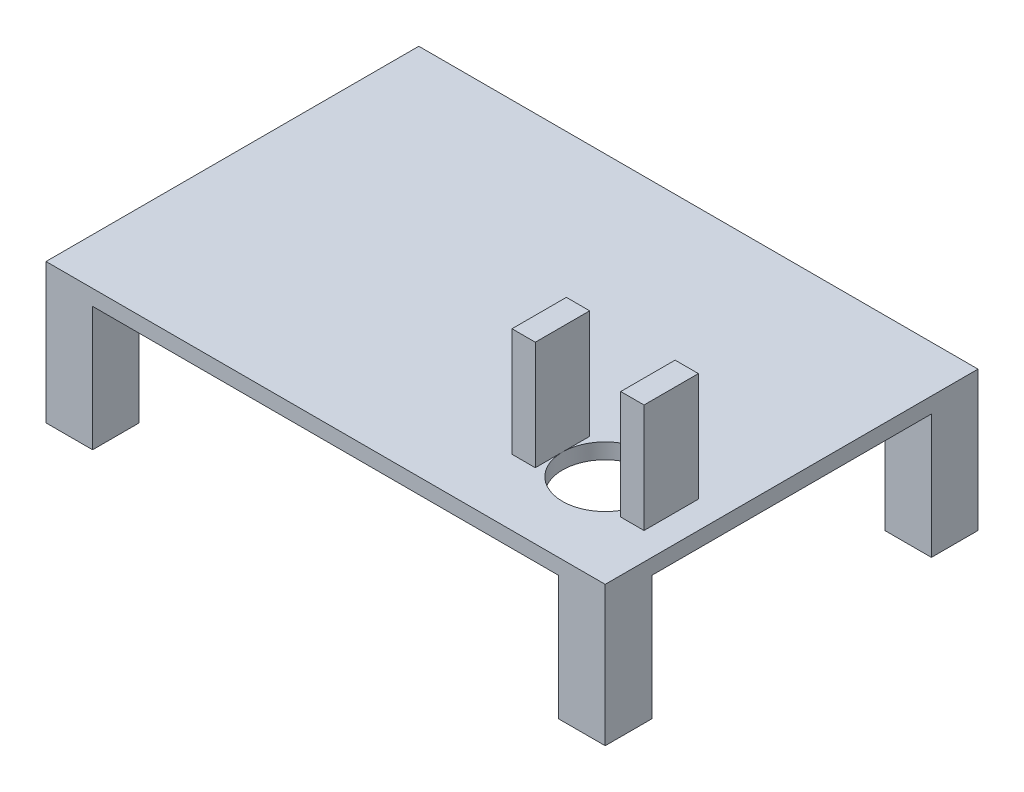
ISO-10303-21;
HEADER;
FILE_DESCRIPTION(('STEP AP214'),'2;1');
FILE_NAME('part.step','',(''),(''),'','','');
FILE_SCHEMA(('AUTOMOTIVE_DESIGN { 1 0 10303 214 1 1 1 1 }'));
ENDSEC;
DATA;
#1=APPLICATION_CONTEXT('core data for automotive mechanical design processes');
#2=APPLICATION_PROTOCOL_DEFINITION('international standard','automotive_design',2000,#1);
#3=PRODUCT_CONTEXT('',#1,'mechanical');
#4=PRODUCT('Part','Part','',(#3));
#5=PRODUCT_RELATED_PRODUCT_CATEGORY('part','',(#4));
#6=PRODUCT_DEFINITION_FORMATION('','',#4);
#7=PRODUCT_DEFINITION_CONTEXT('part definition',#1,'design');
#8=PRODUCT_DEFINITION('design','',#6,#7);
#9=PRODUCT_DEFINITION_SHAPE('','',#8);
#10=(LENGTH_UNIT() NAMED_UNIT(*) SI_UNIT(.MILLI.,.METRE.));
#11=(NAMED_UNIT(*) PLANE_ANGLE_UNIT() SI_UNIT($,.RADIAN.));
#12=(NAMED_UNIT(*) SI_UNIT($,.STERADIAN.) SOLID_ANGLE_UNIT());
#13=UNCERTAINTY_MEASURE_WITH_UNIT(LENGTH_MEASURE(1.E-05),#10,'distance_accuracy_value','');
#14=(GEOMETRIC_REPRESENTATION_CONTEXT(3) GLOBAL_UNCERTAINTY_ASSIGNED_CONTEXT((#13)) GLOBAL_UNIT_ASSIGNED_CONTEXT((#10,
#11,#12)) REPRESENTATION_CONTEXT('',''));
#15=CARTESIAN_POINT('',(0.,0.,0.));
#16=DIRECTION('',(0.,0.,1.));
#17=DIRECTION('',(1.,0.,0.));
#18=AXIS2_PLACEMENT_3D('',#15,#16,#17);
#19=CARTESIAN_POINT('',(0.,0.,0.));
#20=DIRECTION('',(0.,1.,0.));
#21=DIRECTION('',(0.,0.,1.));
#22=AXIS2_PLACEMENT_3D('',#19,#20,#21);
#23=PLANE('',#22);
#24=CARTESIAN_POINT('',(762.,0.,-152.4));
#25=DIRECTION('',(0.,1.,0.));
#26=DIRECTION('',(0.,0.,1.));
#27=AXIS2_PLACEMENT_3D('',#24,#25,#26);
#28=CIRCLE('',#27,69.85);
#29=CARTESIAN_POINT('',(762.,0.,-82.55));
#30=VERTEX_POINT('',#29);
#31=EDGE_CURVE('E428',#30,#30,#28,.T.);
#32=ORIENTED_EDGE('',*,*,#31,.T.);
#33=EDGE_LOOP('',(#32));
#34=FACE_BOUND('',#33,.T.);
#35=DIRECTION('',(0.,0.,-1.));
#36=VECTOR('',#35,1.);
#37=CARTESIAN_POINT('',(838.2,0.,0.));
#38=LINE('',#37,#36);
#39=CARTESIAN_POINT('',(838.2,0.,0.));
#40=VERTEX_POINT('',#39);
#41=CARTESIAN_POINT('',(838.2,0.,-76.2));
#42=VERTEX_POINT('',#41);
#43=EDGE_CURVE('E515',#40,#42,#38,.T.);
#44=ORIENTED_EDGE('',*,*,#43,.F.);
#45=DIRECTION('',(1.,0.,0.));
#46=VECTOR('',#45,1.);
#47=CARTESIAN_POINT('',(0.,0.,0.));
#48=LINE('',#47,#46);
#49=CARTESIAN_POINT('',(76.2,0.,0.));
#50=VERTEX_POINT('',#49);
#51=EDGE_CURVE('E232',#50,#40,#48,.T.);
#52=ORIENTED_EDGE('',*,*,#51,.F.);
#53=DIRECTION('',(0.,0.,1.));
#54=VECTOR('',#53,1.);
#55=CARTESIAN_POINT('',(76.2,0.,0.));
#56=LINE('',#55,#54);
#57=CARTESIAN_POINT('',(76.2,0.,-76.2));
#58=VERTEX_POINT('',#57);
#59=EDGE_CURVE('E310',#58,#50,#56,.T.);
#60=ORIENTED_EDGE('',*,*,#59,.F.);
#61=DIRECTION('',(1.,0.,0.));
#62=VECTOR('',#61,1.);
#63=CARTESIAN_POINT('',(0.,0.,-76.2));
#64=LINE('',#63,#62);
#65=CARTESIAN_POINT('',(0.,0.,-76.2));
#66=VERTEX_POINT('',#65);
#67=EDGE_CURVE('E304',#66,#58,#64,.T.);
#68=ORIENTED_EDGE('',*,*,#67,.F.);
#69=DIRECTION('',(0.,0.,-1.));
#70=VECTOR('',#69,1.);
#71=CARTESIAN_POINT('',(0.,0.,0.));
#72=LINE('',#71,#70);
#73=CARTESIAN_POINT('',(0.,0.,-533.4));
#74=VERTEX_POINT('',#73);
#75=EDGE_CURVE('E442',#66,#74,#72,.T.);
#76=ORIENTED_EDGE('',*,*,#75,.T.);
#77=DIRECTION('',(-1.,0.,0.));
#78=VECTOR('',#77,1.);
#79=CARTESIAN_POINT('',(0.,0.,-533.4));
#80=LINE('',#79,#78);
#81=CARTESIAN_POINT('',(76.2,0.,-533.4));
#82=VERTEX_POINT('',#81);
#83=EDGE_CURVE('E270',#82,#74,#80,.T.);
#84=ORIENTED_EDGE('',*,*,#83,.F.);
#85=DIRECTION('',(0.,0.,1.));
#86=VECTOR('',#85,1.);
#87=CARTESIAN_POINT('',(76.2,0.,-533.4));
#88=LINE('',#87,#86);
#89=CARTESIAN_POINT('',(76.2,0.,-609.6));
#90=VERTEX_POINT('',#89);
#91=EDGE_CURVE('E276',#90,#82,#88,.T.);
#92=ORIENTED_EDGE('',*,*,#91,.F.);
#93=DIRECTION('',(1.,0.,0.));
#94=VECTOR('',#93,1.);
#95=CARTESIAN_POINT('',(0.,0.,-609.6));
#96=LINE('',#95,#94);
#97=CARTESIAN_POINT('',(838.2,0.,-609.6));
#98=VERTEX_POINT('',#97);
#99=EDGE_CURVE('E459',#90,#98,#96,.T.);
#100=ORIENTED_EDGE('',*,*,#99,.T.);
#101=DIRECTION('',(0.,0.,-1.));
#102=VECTOR('',#101,1.);
#103=CARTESIAN_POINT('',(838.2,0.,-533.4));
#104=LINE('',#103,#102);
#105=CARTESIAN_POINT('',(838.2,0.,-533.4));
#106=VERTEX_POINT('',#105);
#107=EDGE_CURVE('E63',#106,#98,#104,.T.);
#108=ORIENTED_EDGE('',*,*,#107,.F.);
#109=DIRECTION('',(-1.,0.,0.));
#110=VECTOR('',#109,1.);
#111=CARTESIAN_POINT('',(838.2,0.,-533.4));
#112=LINE('',#111,#110);
#113=CARTESIAN_POINT('',(914.4,0.,-533.4));
#114=VERTEX_POINT('',#113);
#115=EDGE_CURVE('E234',#114,#106,#112,.T.);
#116=ORIENTED_EDGE('',*,*,#115,.F.);
#117=DIRECTION('',(0.,0.,-1.));
#118=VECTOR('',#117,1.);
#119=CARTESIAN_POINT('',(914.4,0.,0.));
#120=LINE('',#119,#118);
#121=CARTESIAN_POINT('',(914.4,0.,-76.2));
#122=VERTEX_POINT('',#121);
#123=EDGE_CURVE('E456',#122,#114,#120,.T.);
#124=ORIENTED_EDGE('',*,*,#123,.F.);
#125=DIRECTION('',(1.,0.,0.));
#126=VECTOR('',#125,1.);
#127=CARTESIAN_POINT('',(838.2,0.,-76.2));
#128=LINE('',#127,#126);
#129=EDGE_CURVE('E228',#42,#122,#128,.T.);
#130=ORIENTED_EDGE('',*,*,#129,.F.);
#131=EDGE_LOOP('',(#44,#52,#60,#68,#76,#84,#92,#100,#108,#116,#124,#130));
#132=FACE_BOUND('',#131,.T.);
#133=ADVANCED_FACE('F39',(#34,#132),#23,.F.);
#134=CARTESIAN_POINT('',(0.,25.4,0.));
#135=DIRECTION('',(0.,1.,0.));
#136=DIRECTION('',(0.,0.,1.));
#137=AXIS2_PLACEMENT_3D('',#134,#135,#136);
#138=PLANE('',#137);
#139=DIRECTION('',(1.,0.,0.));
#140=VECTOR('',#139,1.);
#141=CARTESIAN_POINT('',(0.,25.4,0.));
#142=LINE('',#141,#140);
#143=CARTESIAN_POINT('',(0.,25.4,0.));
#144=VERTEX_POINT('',#143);
#145=CARTESIAN_POINT('',(914.4,25.4,0.));
#146=VERTEX_POINT('',#145);
#147=EDGE_CURVE('E437',#144,#146,#142,.T.);
#148=ORIENTED_EDGE('',*,*,#147,.T.);
#149=DIRECTION('',(0.,0.,-1.));
#150=VECTOR('',#149,1.);
#151=CARTESIAN_POINT('',(914.4,25.4,0.));
#152=LINE('',#151,#150);
#153=CARTESIAN_POINT('',(914.4,25.4,-609.6));
#154=VERTEX_POINT('',#153);
#155=EDGE_CURVE('E441',#146,#154,#152,.T.);
#156=ORIENTED_EDGE('',*,*,#155,.T.);
#157=DIRECTION('',(1.,0.,0.));
#158=VECTOR('',#157,1.);
#159=CARTESIAN_POINT('',(0.,25.4,-609.6));
#160=LINE('',#159,#158);
#161=CARTESIAN_POINT('',(0.,25.4,-609.6));
#162=VERTEX_POINT('',#161);
#163=EDGE_CURVE('E445',#162,#154,#160,.T.);
#164=ORIENTED_EDGE('',*,*,#163,.F.);
#165=DIRECTION('',(0.,0.,-1.));
#166=VECTOR('',#165,1.);
#167=CARTESIAN_POINT('',(0.,25.4,0.));
#168=LINE('',#167,#166);
#169=EDGE_CURVE('E449',#144,#162,#168,.T.);
#170=ORIENTED_EDGE('',*,*,#169,.F.);
#171=EDGE_LOOP('',(#148,#156,#164,#170));
#172=FACE_BOUND('',#171,.T.);
#173=DIRECTION('',(0.,0.,-1.));
#174=VECTOR('',#173,1.);
#175=CARTESIAN_POINT('',(831.85,25.4,0.));
#176=LINE('',#175,#174);
#177=CARTESIAN_POINT('',(831.85,25.4,-152.4));
#178=VERTEX_POINT('',#177);
#179=CARTESIAN_POINT('',(831.85,25.4,-196.85));
#180=VERTEX_POINT('',#179);
#181=EDGE_CURVE('E367',#178,#180,#176,.T.);
#182=ORIENTED_EDGE('',*,*,#181,.T.);
#183=DIRECTION('',(1.,0.,0.));
#184=VECTOR('',#183,1.);
#185=CARTESIAN_POINT('',(1.43403807347416E-13,25.4,-196.850000000001));
#186=LINE('',#185,#184);
#187=CARTESIAN_POINT('',(869.95,25.4,-196.85));
#188=VERTEX_POINT('',#187);
#189=EDGE_CURVE('E375',#180,#188,#186,.T.);
#190=ORIENTED_EDGE('',*,*,#189,.T.);
#191=DIRECTION('',(0.,0.,-1.));
#192=VECTOR('',#191,1.);
#193=CARTESIAN_POINT('',(869.95,25.4,0.));
#194=LINE('',#193,#192);
#195=CARTESIAN_POINT('',(869.95,25.4,-107.95));
#196=VERTEX_POINT('',#195);
#197=EDGE_CURVE('E378',#196,#188,#194,.T.);
#198=ORIENTED_EDGE('',*,*,#197,.F.);
#199=DIRECTION('',(1.,0.,0.));
#200=VECTOR('',#199,1.);
#201=CARTESIAN_POINT('',(0.,25.4,-107.949999999999));
#202=LINE('',#201,#200);
#203=CARTESIAN_POINT('',(831.85,25.4,-107.95));
#204=VERTEX_POINT('',#203);
#205=EDGE_CURVE('E371',#204,#196,#202,.T.);
#206=ORIENTED_EDGE('',*,*,#205,.F.);
#207=EDGE_CURVE('E370',#204,#178,#176,.T.);
#208=ORIENTED_EDGE('',*,*,#207,.T.);
#209=CARTESIAN_POINT('',(762.,25.4,-152.4));
#210=DIRECTION('',(0.,1.,0.));
#211=DIRECTION('',(0.,0.,1.));
#212=AXIS2_PLACEMENT_3D('',#209,#210,#211);
#213=CIRCLE('',#212,69.85);
#214=CARTESIAN_POINT('',(692.15,25.4,-152.4));
#215=VERTEX_POINT('',#214);
#216=EDGE_CURVE('E429',#215,#178,#213,.T.);
#217=ORIENTED_EDGE('',*,*,#216,.F.);
#218=DIRECTION('',(0.,0.,-1.));
#219=VECTOR('',#218,1.);
#220=CARTESIAN_POINT('',(692.15,25.4,0.));
#221=LINE('',#220,#219);
#222=CARTESIAN_POINT('',(692.15,25.4,-107.95));
#223=VERTEX_POINT('',#222);
#224=EDGE_CURVE('E417',#223,#215,#221,.T.);
#225=ORIENTED_EDGE('',*,*,#224,.F.);
#226=DIRECTION('',(-1.,0.,0.));
#227=VECTOR('',#226,1.);
#228=CARTESIAN_POINT('',(1.57281595155232E-13,25.4,-107.950000000001));
#229=LINE('',#228,#227);
#230=CARTESIAN_POINT('',(654.05,25.4,-107.95));
#231=VERTEX_POINT('',#230);
#232=EDGE_CURVE('E422',#223,#231,#229,.T.);
#233=ORIENTED_EDGE('',*,*,#232,.T.);
#234=DIRECTION('',(0.,0.,-1.));
#235=VECTOR('',#234,1.);
#236=CARTESIAN_POINT('',(654.05,25.4,0.));
#237=LINE('',#236,#235);
#238=CARTESIAN_POINT('',(654.05,25.4,-196.85));
#239=VERTEX_POINT('',#238);
#240=EDGE_CURVE('E425',#231,#239,#237,.T.);
#241=ORIENTED_EDGE('',*,*,#240,.T.);
#242=DIRECTION('',(-1.,0.,0.));
#243=VECTOR('',#242,1.);
#244=CARTESIAN_POINT('',(-4.30211422042245E-13,25.4,-196.849999999999));
#245=LINE('',#244,#243);
#246=CARTESIAN_POINT('',(692.15,25.4,-196.85));
#247=VERTEX_POINT('',#246);
#248=EDGE_CURVE('E418',#247,#239,#245,.T.);
#249=ORIENTED_EDGE('',*,*,#248,.F.);
#250=EDGE_CURVE('E413',#215,#247,#221,.T.);
#251=ORIENTED_EDGE('',*,*,#250,.F.);
#252=EDGE_CURVE('E433',#178,#215,#213,.T.);
#253=ORIENTED_EDGE('',*,*,#252,.F.);
#254=EDGE_LOOP('',(#182,#190,#198,#206,#208,#217,#225,#233,#241,#249,#251,#253));
#255=FACE_BOUND('',#254,.T.);
#256=ADVANCED_FACE('F501',(#172,#255),#138,.T.);
#257=CARTESIAN_POINT('',(0.,25.4,0.));
#258=DIRECTION('',(0.,0.,-1.));
#259=DIRECTION('',(-1.,0.,0.));
#260=AXIS2_PLACEMENT_3D('',#257,#258,#259);
#261=PLANE('',#260);
#262=DIRECTION('',(0.,-1.,0.));
#263=VECTOR('',#262,1.);
#264=CARTESIAN_POINT('',(0.,25.4,0.));
#265=LINE('',#264,#263);
#266=CARTESIAN_POINT('',(0.,-203.2,0.));
#267=VERTEX_POINT('',#266);
#268=EDGE_CURVE('E453',#144,#267,#265,.T.);
#269=ORIENTED_EDGE('',*,*,#268,.T.);
#270=DIRECTION('',(-1.,0.,0.));
#271=VECTOR('',#270,1.);
#272=CARTESIAN_POINT('',(0.,-203.2,0.));
#273=LINE('',#272,#271);
#274=CARTESIAN_POINT('',(76.2,-203.2,0.));
#275=VERTEX_POINT('',#274);
#276=EDGE_CURVE('E316',#275,#267,#273,.T.);
#277=ORIENTED_EDGE('',*,*,#276,.F.);
#278=DIRECTION('',(0.,1.,0.));
#279=VECTOR('',#278,1.);
#280=CARTESIAN_POINT('',(76.2,-203.2,0.));
#281=LINE('',#280,#279);
#282=EDGE_CURVE('E320',#275,#50,#281,.T.);
#283=ORIENTED_EDGE('',*,*,#282,.T.);
#284=ORIENTED_EDGE('',*,*,#51,.T.);
#285=DIRECTION('',(0.,1.,0.));
#286=VECTOR('',#285,1.);
#287=CARTESIAN_POINT('',(838.2,-203.2,0.));
#288=LINE('',#287,#286);
#289=CARTESIAN_POINT('',(838.2,-203.2,0.));
#290=VERTEX_POINT('',#289);
#291=EDGE_CURVE('E211',#290,#40,#288,.T.);
#292=ORIENTED_EDGE('',*,*,#291,.F.);
#293=DIRECTION('',(-1.,0.,0.));
#294=VECTOR('',#293,1.);
#295=CARTESIAN_POINT('',(838.2,-203.2,0.));
#296=LINE('',#295,#294);
#297=CARTESIAN_POINT('',(914.4,-203.2,0.));
#298=VERTEX_POINT('',#297);
#299=EDGE_CURVE('E219',#298,#290,#296,.T.);
#300=ORIENTED_EDGE('',*,*,#299,.F.);
#301=DIRECTION('',(0.,-1.,0.));
#302=VECTOR('',#301,1.);
#303=CARTESIAN_POINT('',(914.4,25.4,0.));
#304=LINE('',#303,#302);
#305=EDGE_CURVE('E11',#146,#298,#304,.T.);
#306=ORIENTED_EDGE('',*,*,#305,.F.);
#307=ORIENTED_EDGE('',*,*,#147,.F.);
#308=EDGE_LOOP('',(#269,#277,#283,#284,#292,#300,#306,#307));
#309=FACE_BOUND('',#308,.T.);
#310=ADVANCED_FACE('F41',(#309),#261,.F.);
#311=CARTESIAN_POINT('',(914.4,25.4,0.));
#312=DIRECTION('',(-1.,0.,0.));
#313=DIRECTION('',(0.,0.,1.));
#314=AXIS2_PLACEMENT_3D('',#311,#312,#313);
#315=PLANE('',#314);
#316=ORIENTED_EDGE('',*,*,#305,.T.);
#317=DIRECTION('',(0.,0.,1.));
#318=VECTOR('',#317,1.);
#319=CARTESIAN_POINT('',(914.4,-203.2,0.));
#320=LINE('',#319,#318);
#321=CARTESIAN_POINT('',(914.4,-203.2,-76.2));
#322=VERTEX_POINT('',#321);
#323=EDGE_CURVE('E224',#322,#298,#320,.T.);
#324=ORIENTED_EDGE('',*,*,#323,.F.);
#325=DIRECTION('',(0.,1.,0.));
#326=VECTOR('',#325,1.);
#327=CARTESIAN_POINT('',(914.4,-203.2,-76.2));
#328=LINE('',#327,#326);
#329=EDGE_CURVE('E55',#322,#122,#328,.T.);
#330=ORIENTED_EDGE('',*,*,#329,.T.);
#331=ORIENTED_EDGE('',*,*,#123,.T.);
#332=DIRECTION('',(0.,1.,0.));
#333=VECTOR('',#332,1.);
#334=CARTESIAN_POINT('',(914.4,-203.2,-533.4));
#335=LINE('',#334,#333);
#336=CARTESIAN_POINT('',(914.4,-203.2,-533.4));
#337=VERTEX_POINT('',#336);
#338=EDGE_CURVE('E256',#337,#114,#335,.T.);
#339=ORIENTED_EDGE('',*,*,#338,.F.);
#340=DIRECTION('',(0.,0.,1.));
#341=VECTOR('',#340,1.);
#342=CARTESIAN_POINT('',(914.4,-203.2,-533.4));
#343=LINE('',#342,#341);
#344=CARTESIAN_POINT('',(914.4,-203.2,-609.6));
#345=VERTEX_POINT('',#344);
#346=EDGE_CURVE('E254',#345,#337,#343,.T.);
#347=ORIENTED_EDGE('',*,*,#346,.F.);
#348=DIRECTION('',(0.,-1.,0.));
#349=VECTOR('',#348,1.);
#350=CARTESIAN_POINT('',(914.4,25.4,-609.6));
#351=LINE('',#350,#349);
#352=EDGE_CURVE('E48',#154,#345,#351,.T.);
#353=ORIENTED_EDGE('',*,*,#352,.F.);
#354=ORIENTED_EDGE('',*,*,#155,.F.);
#355=EDGE_LOOP('',(#316,#324,#330,#331,#339,#347,#353,#354));
#356=FACE_BOUND('',#355,.T.);
#357=ADVANCED_FACE('F480',(#356),#315,.F.);
#358=CARTESIAN_POINT('',(0.,25.4,-609.6));
#359=DIRECTION('',(0.,0.,-1.));
#360=DIRECTION('',(-1.,0.,0.));
#361=AXIS2_PLACEMENT_3D('',#358,#359,#360);
#362=PLANE('',#361);
#363=ORIENTED_EDGE('',*,*,#99,.F.);
#364=DIRECTION('',(0.,1.,0.));
#365=VECTOR('',#364,1.);
#366=CARTESIAN_POINT('',(76.2,-203.2,-609.6));
#367=LINE('',#366,#365);
#368=CARTESIAN_POINT('',(76.2,-203.2,-609.6));
#369=VERTEX_POINT('',#368);
#370=EDGE_CURVE('E296',#369,#90,#367,.T.);
#371=ORIENTED_EDGE('',*,*,#370,.F.);
#372=DIRECTION('',(1.,0.,0.));
#373=VECTOR('',#372,1.);
#374=CARTESIAN_POINT('',(0.,-203.2,-609.6));
#375=LINE('',#374,#373);
#376=CARTESIAN_POINT('',(0.,-203.2,-609.6));
#377=VERTEX_POINT('',#376);
#378=EDGE_CURVE('E280',#377,#369,#375,.T.);
#379=ORIENTED_EDGE('',*,*,#378,.F.);
#380=DIRECTION('',(0.,-1.,0.));
#381=VECTOR('',#380,1.);
#382=CARTESIAN_POINT('',(0.,25.4,-609.6));
#383=LINE('',#382,#381);
#384=EDGE_CURVE('E466',#162,#377,#383,.T.);
#385=ORIENTED_EDGE('',*,*,#384,.F.);
#386=ORIENTED_EDGE('',*,*,#163,.T.);
#387=ORIENTED_EDGE('',*,*,#352,.T.);
#388=DIRECTION('',(1.,0.,0.));
#389=VECTOR('',#388,1.);
#390=CARTESIAN_POINT('',(838.2,-203.2,-609.6));
#391=LINE('',#390,#389);
#392=CARTESIAN_POINT('',(838.2,-203.2,-609.6));
#393=VERTEX_POINT('',#392);
#394=EDGE_CURVE('E250',#393,#345,#391,.T.);
#395=ORIENTED_EDGE('',*,*,#394,.F.);
#396=DIRECTION('',(0.,1.,0.));
#397=VECTOR('',#396,1.);
#398=CARTESIAN_POINT('',(838.2,-203.2,-609.6));
#399=LINE('',#398,#397);
#400=EDGE_CURVE('E263',#393,#98,#399,.T.);
#401=ORIENTED_EDGE('',*,*,#400,.T.);
#402=EDGE_LOOP('',(#363,#371,#379,#385,#386,#387,#395,#401));
#403=FACE_BOUND('',#402,.T.);
#404=ADVANCED_FACE('F473',(#403),#362,.T.);
#405=CARTESIAN_POINT('',(0.,25.4,0.));
#406=DIRECTION('',(-1.,0.,0.));
#407=DIRECTION('',(0.,0.,1.));
#408=AXIS2_PLACEMENT_3D('',#405,#406,#407);
#409=PLANE('',#408);
#410=ORIENTED_EDGE('',*,*,#75,.F.);
#411=DIRECTION('',(0.,1.,0.));
#412=VECTOR('',#411,1.);
#413=CARTESIAN_POINT('',(0.,-203.2,-76.2));
#414=LINE('',#413,#412);
#415=CARTESIAN_POINT('',(0.,-203.2,-76.2));
#416=VERTEX_POINT('',#415);
#417=EDGE_CURVE('E333',#416,#66,#414,.T.);
#418=ORIENTED_EDGE('',*,*,#417,.F.);
#419=DIRECTION('',(0.,0.,-1.));
#420=VECTOR('',#419,1.);
#421=CARTESIAN_POINT('',(0.,-203.2,0.));
#422=LINE('',#421,#420);
#423=EDGE_CURVE('E305',#267,#416,#422,.T.);
#424=ORIENTED_EDGE('',*,*,#423,.F.);
#425=ORIENTED_EDGE('',*,*,#268,.F.);
#426=ORIENTED_EDGE('',*,*,#169,.T.);
#427=ORIENTED_EDGE('',*,*,#384,.T.);
#428=DIRECTION('',(0.,0.,-1.));
#429=VECTOR('',#428,1.);
#430=CARTESIAN_POINT('',(0.,-203.2,-533.4));
#431=LINE('',#430,#429);
#432=CARTESIAN_POINT('',(0.,-203.2,-533.4));
#433=VERTEX_POINT('',#432);
#434=EDGE_CURVE('E275',#433,#377,#431,.T.);
#435=ORIENTED_EDGE('',*,*,#434,.F.);
#436=DIRECTION('',(0.,1.,0.));
#437=VECTOR('',#436,1.);
#438=CARTESIAN_POINT('',(0.,-203.2,-533.4));
#439=LINE('',#438,#437);
#440=EDGE_CURVE('E300',#433,#74,#439,.T.);
#441=ORIENTED_EDGE('',*,*,#440,.T.);
#442=EDGE_LOOP('',(#410,#418,#424,#425,#426,#427,#435,#441));
#443=FACE_BOUND('',#442,.T.);
#444=ADVANCED_FACE('F504',(#443),#409,.T.);
#445=CARTESIAN_POINT('',(762.,25.4,-152.4));
#446=DIRECTION('',(0.,-1.,0.));
#447=DIRECTION('',(0.,0.,-1.));
#448=AXIS2_PLACEMENT_3D('',#445,#446,#447);
#449=CYLINDRICAL_SURFACE('',#448,69.85);
#450=ORIENTED_EDGE('',*,*,#31,.F.);
#451=EDGE_LOOP('',(#450));
#452=FACE_BOUND('',#451,.T.);
#453=ORIENTED_EDGE('',*,*,#216,.T.);
#454=ORIENTED_EDGE('',*,*,#252,.T.);
#455=EDGE_LOOP('',(#453,#454));
#456=FACE_BOUND('',#455,.T.);
#457=ADVANCED_FACE('F533',(#452,#456),#449,.F.);
#458=CARTESIAN_POINT('',(654.05,203.2,-196.85));
#459=DIRECTION('',(1.,0.,0.));
#460=DIRECTION('',(0.,0.,-1.));
#461=AXIS2_PLACEMENT_3D('',#458,#459,#460);
#462=PLANE('',#461);
#463=ORIENTED_EDGE('',*,*,#240,.F.);
#464=DIRECTION('',(0.,-1.,0.));
#465=VECTOR('',#464,1.);
#466=CARTESIAN_POINT('',(654.05,203.2,-107.95));
#467=LINE('',#466,#465);
#468=CARTESIAN_POINT('',(654.05,203.2,-107.95));
#469=VERTEX_POINT('',#468);
#470=EDGE_CURVE('E409',#469,#231,#467,.T.);
#471=ORIENTED_EDGE('',*,*,#470,.F.);
#472=DIRECTION('',(0.,0.,1.));
#473=VECTOR('',#472,1.);
#474=CARTESIAN_POINT('',(654.05,203.2,-196.85));
#475=LINE('',#474,#473);
#476=CARTESIAN_POINT('',(654.05,203.2,-196.85));
#477=VERTEX_POINT('',#476);
#478=EDGE_CURVE('E382',#477,#469,#475,.T.);
#479=ORIENTED_EDGE('',*,*,#478,.F.);
#480=DIRECTION('',(0.,-1.,0.));
#481=VECTOR('',#480,1.);
#482=CARTESIAN_POINT('',(654.05,203.2,-196.85));
#483=LINE('',#482,#481);
#484=EDGE_CURVE('E397',#477,#239,#483,.T.);
#485=ORIENTED_EDGE('',*,*,#484,.T.);
#486=EDGE_LOOP('',(#463,#471,#479,#485));
#487=FACE_BOUND('',#486,.T.);
#488=ADVANCED_FACE('F555',(#487),#462,.F.);
#489=CARTESIAN_POINT('',(654.05,203.2,-107.95));
#490=DIRECTION('',(0.,0.,-1.));
#491=DIRECTION('',(-1.,0.,0.));
#492=AXIS2_PLACEMENT_3D('',#489,#490,#491);
#493=PLANE('',#492);
#494=ORIENTED_EDGE('',*,*,#232,.F.);
#495=DIRECTION('',(0.,-1.,0.));
#496=VECTOR('',#495,1.);
#497=CARTESIAN_POINT('',(692.15,203.2,-107.95));
#498=LINE('',#497,#496);
#499=CARTESIAN_POINT('',(692.15,203.2,-107.95));
#500=VERTEX_POINT('',#499);
#501=EDGE_CURVE('E405',#500,#223,#498,.T.);
#502=ORIENTED_EDGE('',*,*,#501,.F.);
#503=DIRECTION('',(1.,0.,0.));
#504=VECTOR('',#503,1.);
#505=CARTESIAN_POINT('',(654.05,203.2,-107.95));
#506=LINE('',#505,#504);
#507=EDGE_CURVE('E386',#469,#500,#506,.T.);
#508=ORIENTED_EDGE('',*,*,#507,.F.);
#509=ORIENTED_EDGE('',*,*,#470,.T.);
#510=EDGE_LOOP('',(#494,#502,#508,#509));
#511=FACE_BOUND('',#510,.T.);
#512=ADVANCED_FACE('F564',(#511),#493,.F.);
#513=CARTESIAN_POINT('',(692.15,203.2,-196.85));
#514=DIRECTION('',(1.,0.,0.));
#515=DIRECTION('',(0.,0.,-1.));
#516=AXIS2_PLACEMENT_3D('',#513,#514,#515);
#517=PLANE('',#516);
#518=ORIENTED_EDGE('',*,*,#501,.T.);
#519=ORIENTED_EDGE('',*,*,#224,.T.);
#520=ORIENTED_EDGE('',*,*,#250,.T.);
#521=DIRECTION('',(0.,-1.,0.));
#522=VECTOR('',#521,1.);
#523=CARTESIAN_POINT('',(692.15,203.2,-196.85));
#524=LINE('',#523,#522);
#525=CARTESIAN_POINT('',(692.15,203.2,-196.85));
#526=VERTEX_POINT('',#525);
#527=EDGE_CURVE('E401',#526,#247,#524,.T.);
#528=ORIENTED_EDGE('',*,*,#527,.F.);
#529=DIRECTION('',(0.,0.,1.));
#530=VECTOR('',#529,1.);
#531=CARTESIAN_POINT('',(692.15,203.2,-196.85));
#532=LINE('',#531,#530);
#533=EDGE_CURVE('E389',#526,#500,#532,.T.);
#534=ORIENTED_EDGE('',*,*,#533,.T.);
#535=EDGE_LOOP('',(#518,#519,#520,#528,#534));
#536=FACE_BOUND('',#535,.T.);
#537=ADVANCED_FACE('F574',(#536),#517,.T.);
#538=CARTESIAN_POINT('',(654.05,203.2,-196.85));
#539=DIRECTION('',(0.,0.,-1.));
#540=DIRECTION('',(-1.,0.,0.));
#541=AXIS2_PLACEMENT_3D('',#538,#539,#540);
#542=PLANE('',#541);
#543=ORIENTED_EDGE('',*,*,#527,.T.);
#544=ORIENTED_EDGE('',*,*,#248,.T.);
#545=ORIENTED_EDGE('',*,*,#484,.F.);
#546=DIRECTION('',(1.,0.,0.));
#547=VECTOR('',#546,1.);
#548=CARTESIAN_POINT('',(654.05,203.2,-196.85));
#549=LINE('',#548,#547);
#550=EDGE_CURVE('E393',#477,#526,#549,.T.);
#551=ORIENTED_EDGE('',*,*,#550,.T.);
#552=EDGE_LOOP('',(#543,#544,#545,#551));
#553=FACE_BOUND('',#552,.T.);
#554=ADVANCED_FACE('F584',(#553),#542,.T.);
#555=CARTESIAN_POINT('',(0.,203.2,0.));
#556=DIRECTION('',(0.,1.,0.));
#557=DIRECTION('',(0.,0.,1.));
#558=AXIS2_PLACEMENT_3D('',#555,#556,#557);
#559=PLANE('',#558);
#560=ORIENTED_EDGE('',*,*,#478,.T.);
#561=ORIENTED_EDGE('',*,*,#507,.T.);
#562=ORIENTED_EDGE('',*,*,#533,.F.);
#563=ORIENTED_EDGE('',*,*,#550,.F.);
#564=EDGE_LOOP('',(#560,#561,#562,#563));
#565=FACE_BOUND('',#564,.T.);
#566=ADVANCED_FACE('F594',(#565),#559,.T.);
#567=CARTESIAN_POINT('',(869.95,203.2,-196.85));
#568=DIRECTION('',(1.,0.,0.));
#569=DIRECTION('',(0.,0.,-1.));
#570=AXIS2_PLACEMENT_3D('',#567,#568,#569);
#571=PLANE('',#570);
#572=DIRECTION('',(0.,-1.,0.));
#573=VECTOR('',#572,1.);
#574=CARTESIAN_POINT('',(869.95,203.2,-107.95));
#575=LINE('',#574,#573);
#576=CARTESIAN_POINT('',(869.95,203.2,-107.95));
#577=VERTEX_POINT('',#576);
#578=EDGE_CURVE('E338',#577,#196,#575,.T.);
#579=ORIENTED_EDGE('',*,*,#578,.T.);
#580=ORIENTED_EDGE('',*,*,#197,.T.);
#581=DIRECTION('',(0.,-1.,0.));
#582=VECTOR('',#581,1.);
#583=CARTESIAN_POINT('',(869.95,203.2,-196.85));
#584=LINE('',#583,#582);
#585=CARTESIAN_POINT('',(869.95,203.2,-196.85));
#586=VERTEX_POINT('',#585);
#587=EDGE_CURVE('E337',#586,#188,#584,.T.);
#588=ORIENTED_EDGE('',*,*,#587,.F.);
#589=DIRECTION('',(0.,0.,1.));
#590=VECTOR('',#589,1.);
#591=CARTESIAN_POINT('',(869.95,203.2,-196.85));
#592=LINE('',#591,#590);
#593=EDGE_CURVE('E363',#586,#577,#592,.T.);
#594=ORIENTED_EDGE('',*,*,#593,.T.);
#595=EDGE_LOOP('',(#579,#580,#588,#594));
#596=FACE_BOUND('',#595,.T.);
#597=ADVANCED_FACE('F604',(#596),#571,.T.);
#598=CARTESIAN_POINT('',(869.95,203.2,-196.85));
#599=DIRECTION('',(0.,0.,1.));
#600=DIRECTION('',(1.,0.,0.));
#601=AXIS2_PLACEMENT_3D('',#598,#599,#600);
#602=PLANE('',#601);
#603=ORIENTED_EDGE('',*,*,#189,.F.);
#604=DIRECTION('',(0.,-1.,0.));
#605=VECTOR('',#604,1.);
#606=CARTESIAN_POINT('',(831.85,203.2,-196.85));
#607=LINE('',#606,#605);
#608=CARTESIAN_POINT('',(831.85,203.2,-196.85));
#609=VERTEX_POINT('',#608);
#610=EDGE_CURVE('E347',#609,#180,#607,.T.);
#611=ORIENTED_EDGE('',*,*,#610,.F.);
#612=DIRECTION('',(-1.,0.,0.));
#613=VECTOR('',#612,1.);
#614=CARTESIAN_POINT('',(869.95,203.2,-196.85));
#615=LINE('',#614,#613);
#616=EDGE_CURVE('E342',#586,#609,#615,.T.);
#617=ORIENTED_EDGE('',*,*,#616,.F.);
#618=ORIENTED_EDGE('',*,*,#587,.T.);
#619=EDGE_LOOP('',(#603,#611,#617,#618));
#620=FACE_BOUND('',#619,.T.);
#621=ADVANCED_FACE('F614',(#620),#602,.F.);
#622=CARTESIAN_POINT('',(831.85,203.2,-196.85));
#623=DIRECTION('',(1.,0.,0.));
#624=DIRECTION('',(0.,0.,-1.));
#625=AXIS2_PLACEMENT_3D('',#622,#623,#624);
#626=PLANE('',#625);
#627=ORIENTED_EDGE('',*,*,#207,.F.);
#628=DIRECTION('',(0.,-1.,0.));
#629=VECTOR('',#628,1.);
#630=CARTESIAN_POINT('',(831.85,203.2,-107.95));
#631=LINE('',#630,#629);
#632=CARTESIAN_POINT('',(831.85,203.2,-107.95));
#633=VERTEX_POINT('',#632);
#634=EDGE_CURVE('E343',#633,#204,#631,.T.);
#635=ORIENTED_EDGE('',*,*,#634,.F.);
#636=DIRECTION('',(0.,0.,1.));
#637=VECTOR('',#636,1.);
#638=CARTESIAN_POINT('',(831.85,203.2,-196.85));
#639=LINE('',#638,#637);
#640=EDGE_CURVE('E356',#609,#633,#639,.T.);
#641=ORIENTED_EDGE('',*,*,#640,.F.);
#642=ORIENTED_EDGE('',*,*,#610,.T.);
#643=ORIENTED_EDGE('',*,*,#181,.F.);
#644=EDGE_LOOP('',(#627,#635,#641,#642,#643));
#645=FACE_BOUND('',#644,.T.);
#646=ADVANCED_FACE('F624',(#645),#626,.F.);
#647=CARTESIAN_POINT('',(869.95,203.2,-107.95));
#648=DIRECTION('',(0.,0.,1.));
#649=DIRECTION('',(1.,0.,0.));
#650=AXIS2_PLACEMENT_3D('',#647,#648,#649);
#651=PLANE('',#650);
#652=ORIENTED_EDGE('',*,*,#634,.T.);
#653=ORIENTED_EDGE('',*,*,#205,.T.);
#654=ORIENTED_EDGE('',*,*,#578,.F.);
#655=DIRECTION('',(-1.,0.,0.));
#656=VECTOR('',#655,1.);
#657=CARTESIAN_POINT('',(869.95,203.2,-107.95));
#658=LINE('',#657,#656);
#659=EDGE_CURVE('E359',#577,#633,#658,.T.);
#660=ORIENTED_EDGE('',*,*,#659,.T.);
#661=EDGE_LOOP('',(#652,#653,#654,#660));
#662=FACE_BOUND('',#661,.T.);
#663=ADVANCED_FACE('F634',(#662),#651,.T.);
#664=CARTESIAN_POINT('',(0.,203.2,0.));
#665=DIRECTION('',(0.,-1.,0.));
#666=DIRECTION('',(0.,0.,-1.));
#667=AXIS2_PLACEMENT_3D('',#664,#665,#666);
#668=PLANE('',#667);
#669=ORIENTED_EDGE('',*,*,#593,.F.);
#670=ORIENTED_EDGE('',*,*,#616,.T.);
#671=ORIENTED_EDGE('',*,*,#640,.T.);
#672=ORIENTED_EDGE('',*,*,#659,.F.);
#673=EDGE_LOOP('',(#669,#670,#671,#672));
#674=FACE_BOUND('',#673,.T.);
#675=ADVANCED_FACE('F644',(#674),#668,.F.);
#676=CARTESIAN_POINT('',(0.,-203.2,-76.2));
#677=DIRECTION('',(0.,0.,1.));
#678=DIRECTION('',(1.,0.,0.));
#679=AXIS2_PLACEMENT_3D('',#676,#677,#678);
#680=PLANE('',#679);
#681=ORIENTED_EDGE('',*,*,#67,.T.);
#682=DIRECTION('',(0.,1.,0.));
#683=VECTOR('',#682,1.);
#684=CARTESIAN_POINT('',(76.2,-203.2,-76.2));
#685=LINE('',#684,#683);
#686=CARTESIAN_POINT('',(76.2,-203.2,-76.2));
#687=VERTEX_POINT('',#686);
#688=EDGE_CURVE('E329',#687,#58,#685,.T.);
#689=ORIENTED_EDGE('',*,*,#688,.F.);
#690=DIRECTION('',(1.,0.,0.));
#691=VECTOR('',#690,1.);
#692=CARTESIAN_POINT('',(0.,-203.2,-76.2));
#693=LINE('',#692,#691);
#694=EDGE_CURVE('E309',#416,#687,#693,.T.);
#695=ORIENTED_EDGE('',*,*,#694,.F.);
#696=ORIENTED_EDGE('',*,*,#417,.T.);
#697=EDGE_LOOP('',(#681,#689,#695,#696));
#698=FACE_BOUND('',#697,.T.);
#699=ADVANCED_FACE('F653',(#698),#680,.F.);
#700=CARTESIAN_POINT('',(76.2,-203.2,0.));
#701=DIRECTION('',(-1.,0.,0.));
#702=DIRECTION('',(0.,0.,1.));
#703=AXIS2_PLACEMENT_3D('',#700,#701,#702);
#704=PLANE('',#703);
#705=ORIENTED_EDGE('',*,*,#59,.T.);
#706=ORIENTED_EDGE('',*,*,#282,.F.);
#707=DIRECTION('',(0.,0.,1.));
#708=VECTOR('',#707,1.);
#709=CARTESIAN_POINT('',(76.2,-203.2,0.));
#710=LINE('',#709,#708);
#711=EDGE_CURVE('E313',#687,#275,#710,.T.);
#712=ORIENTED_EDGE('',*,*,#711,.F.);
#713=ORIENTED_EDGE('',*,*,#688,.T.);
#714=EDGE_LOOP('',(#705,#706,#712,#713));
#715=FACE_BOUND('',#714,.T.);
#716=ADVANCED_FACE('F708',(#715),#704,.F.);
#717=CARTESIAN_POINT('',(0.,-203.2,0.));
#718=DIRECTION('',(0.,-1.,0.));
#719=DIRECTION('',(0.,0.,-1.));
#720=AXIS2_PLACEMENT_3D('',#717,#718,#719);
#721=PLANE('',#720);
#722=ORIENTED_EDGE('',*,*,#423,.T.);
#723=ORIENTED_EDGE('',*,*,#694,.T.);
#724=ORIENTED_EDGE('',*,*,#711,.T.);
#725=ORIENTED_EDGE('',*,*,#276,.T.);
#726=EDGE_LOOP('',(#722,#723,#724,#725));
#727=FACE_BOUND('',#726,.T.);
#728=ADVANCED_FACE('F717',(#727),#721,.T.);
#729=CARTESIAN_POINT('',(0.,-203.2,-533.4));
#730=DIRECTION('',(0.,0.,-1.));
#731=DIRECTION('',(-1.,0.,0.));
#732=AXIS2_PLACEMENT_3D('',#729,#730,#731);
#733=PLANE('',#732);
#734=ORIENTED_EDGE('',*,*,#83,.T.);
#735=ORIENTED_EDGE('',*,*,#440,.F.);
#736=DIRECTION('',(-1.,0.,0.));
#737=VECTOR('',#736,1.);
#738=CARTESIAN_POINT('',(0.,-203.2,-533.4));
#739=LINE('',#738,#737);
#740=CARTESIAN_POINT('',(76.2,-203.2,-533.4));
#741=VERTEX_POINT('',#740);
#742=EDGE_CURVE('E271',#741,#433,#739,.T.);
#743=ORIENTED_EDGE('',*,*,#742,.F.);
#744=DIRECTION('',(0.,1.,0.));
#745=VECTOR('',#744,1.);
#746=CARTESIAN_POINT('',(76.2,-203.2,-533.4));
#747=LINE('',#746,#745);
#748=EDGE_CURVE('E286',#741,#82,#747,.T.);
#749=ORIENTED_EDGE('',*,*,#748,.T.);
#750=EDGE_LOOP('',(#734,#735,#743,#749));
#751=FACE_BOUND('',#750,.T.);
#752=ADVANCED_FACE('F726',(#751),#733,.F.);
#753=CARTESIAN_POINT('',(76.2,-203.2,-533.4));
#754=DIRECTION('',(-1.,0.,0.));
#755=DIRECTION('',(0.,0.,1.));
#756=AXIS2_PLACEMENT_3D('',#753,#754,#755);
#757=PLANE('',#756);
#758=ORIENTED_EDGE('',*,*,#91,.T.);
#759=ORIENTED_EDGE('',*,*,#748,.F.);
#760=DIRECTION('',(0.,0.,1.));
#761=VECTOR('',#760,1.);
#762=CARTESIAN_POINT('',(76.2,-203.2,-533.4));
#763=LINE('',#762,#761);
#764=EDGE_CURVE('E283',#369,#741,#763,.T.);
#765=ORIENTED_EDGE('',*,*,#764,.F.);
#766=ORIENTED_EDGE('',*,*,#370,.T.);
#767=EDGE_LOOP('',(#758,#759,#765,#766));
#768=FACE_BOUND('',#767,.T.);
#769=ADVANCED_FACE('F492',(#768),#757,.F.);
#770=CARTESIAN_POINT('',(0.,-203.2,0.));
#771=DIRECTION('',(0.,1.,0.));
#772=DIRECTION('',(0.,0.,1.));
#773=AXIS2_PLACEMENT_3D('',#770,#771,#772);
#774=PLANE('',#773);
#775=ORIENTED_EDGE('',*,*,#742,.T.);
#776=ORIENTED_EDGE('',*,*,#434,.T.);
#777=ORIENTED_EDGE('',*,*,#378,.T.);
#778=ORIENTED_EDGE('',*,*,#764,.T.);
#779=EDGE_LOOP('',(#775,#776,#777,#778));
#780=FACE_BOUND('',#779,.T.);
#781=ADVANCED_FACE('F496',(#780),#774,.F.);
#782=CARTESIAN_POINT('',(838.2,-203.2,-533.4));
#783=DIRECTION('',(0.,0.,-1.));
#784=DIRECTION('',(-1.,0.,0.));
#785=AXIS2_PLACEMENT_3D('',#782,#783,#784);
#786=PLANE('',#785);
#787=ORIENTED_EDGE('',*,*,#115,.T.);
#788=DIRECTION('',(0.,1.,0.));
#789=VECTOR('',#788,1.);
#790=CARTESIAN_POINT('',(838.2,-203.2,-533.4));
#791=LINE('',#790,#789);
#792=CARTESIAN_POINT('',(838.2,-203.2,-533.4));
#793=VERTEX_POINT('',#792);
#794=EDGE_CURVE('E267',#793,#106,#791,.T.);
#795=ORIENTED_EDGE('',*,*,#794,.F.);
#796=DIRECTION('',(-1.,0.,0.));
#797=VECTOR('',#796,1.);
#798=CARTESIAN_POINT('',(838.2,-203.2,-533.4));
#799=LINE('',#798,#797);
#800=EDGE_CURVE('E243',#337,#793,#799,.T.);
#801=ORIENTED_EDGE('',*,*,#800,.F.);
#802=ORIENTED_EDGE('',*,*,#338,.T.);
#803=EDGE_LOOP('',(#787,#795,#801,#802));
#804=FACE_BOUND('',#803,.T.);
#805=ADVANCED_FACE('F485',(#804),#786,.F.);
#806=CARTESIAN_POINT('',(838.2,-203.2,-533.4));
#807=DIRECTION('',(1.,0.,0.));
#808=DIRECTION('',(0.,0.,-1.));
#809=AXIS2_PLACEMENT_3D('',#806,#807,#808);
#810=PLANE('',#809);
#811=ORIENTED_EDGE('',*,*,#107,.T.);
#812=ORIENTED_EDGE('',*,*,#400,.F.);
#813=DIRECTION('',(0.,0.,-1.));
#814=VECTOR('',#813,1.);
#815=CARTESIAN_POINT('',(838.2,-203.2,-533.4));
#816=LINE('',#815,#814);
#817=EDGE_CURVE('E247',#793,#393,#816,.T.);
#818=ORIENTED_EDGE('',*,*,#817,.F.);
#819=ORIENTED_EDGE('',*,*,#794,.T.);
#820=EDGE_LOOP('',(#811,#812,#818,#819));
#821=FACE_BOUND('',#820,.T.);
#822=ADVANCED_FACE('F487',(#821),#810,.F.);
#823=CARTESIAN_POINT('',(0.,-203.2,0.));
#824=DIRECTION('',(0.,1.,0.));
#825=DIRECTION('',(0.,0.,1.));
#826=AXIS2_PLACEMENT_3D('',#823,#824,#825);
#827=PLANE('',#826);
#828=ORIENTED_EDGE('',*,*,#800,.T.);
#829=ORIENTED_EDGE('',*,*,#817,.T.);
#830=ORIENTED_EDGE('',*,*,#394,.T.);
#831=ORIENTED_EDGE('',*,*,#346,.T.);
#832=EDGE_LOOP('',(#828,#829,#830,#831));
#833=FACE_BOUND('',#832,.T.);
#834=ADVANCED_FACE('F477',(#833),#827,.F.);
#835=CARTESIAN_POINT('',(838.2,-203.2,0.));
#836=DIRECTION('',(1.,0.,0.));
#837=DIRECTION('',(0.,0.,-1.));
#838=AXIS2_PLACEMENT_3D('',#835,#836,#837);
#839=PLANE('',#838);
#840=ORIENTED_EDGE('',*,*,#43,.T.);
#841=DIRECTION('',(0.,1.,0.));
#842=VECTOR('',#841,1.);
#843=CARTESIAN_POINT('',(838.2,-203.2,-76.2));
#844=LINE('',#843,#842);
#845=CARTESIAN_POINT('',(838.2,-203.2,-76.2));
#846=VERTEX_POINT('',#845);
#847=EDGE_CURVE('E214',#846,#42,#844,.T.);
#848=ORIENTED_EDGE('',*,*,#847,.F.);
#849=DIRECTION('',(0.,0.,-1.));
#850=VECTOR('',#849,1.);
#851=CARTESIAN_POINT('',(838.2,-203.2,0.));
#852=LINE('',#851,#850);
#853=EDGE_CURVE('E207',#290,#846,#852,.T.);
#854=ORIENTED_EDGE('',*,*,#853,.F.);
#855=ORIENTED_EDGE('',*,*,#291,.T.);
#856=EDGE_LOOP('',(#840,#848,#854,#855));
#857=FACE_BOUND('',#856,.T.);
#858=ADVANCED_FACE('F209',(#857),#839,.F.);
#859=CARTESIAN_POINT('',(838.2,-203.2,-76.2));
#860=DIRECTION('',(0.,0.,1.));
#861=DIRECTION('',(1.,0.,0.));
#862=AXIS2_PLACEMENT_3D('',#859,#860,#861);
#863=PLANE('',#862);
#864=ORIENTED_EDGE('',*,*,#129,.T.);
#865=ORIENTED_EDGE('',*,*,#329,.F.);
#866=DIRECTION('',(1.,0.,0.));
#867=VECTOR('',#866,1.);
#868=CARTESIAN_POINT('',(838.2,-203.2,-76.2));
#869=LINE('',#868,#867);
#870=EDGE_CURVE('E218',#846,#322,#869,.T.);
#871=ORIENTED_EDGE('',*,*,#870,.F.);
#872=ORIENTED_EDGE('',*,*,#847,.T.);
#873=EDGE_LOOP('',(#864,#865,#871,#872));
#874=FACE_BOUND('',#873,.T.);
#875=ADVANCED_FACE('F521',(#874),#863,.F.);
#876=CARTESIAN_POINT('',(0.,-203.2,0.));
#877=DIRECTION('',(0.,1.,0.));
#878=DIRECTION('',(0.,0.,1.));
#879=AXIS2_PLACEMENT_3D('',#876,#877,#878);
#880=PLANE('',#879);
#881=ORIENTED_EDGE('',*,*,#299,.T.);
#882=ORIENTED_EDGE('',*,*,#853,.T.);
#883=ORIENTED_EDGE('',*,*,#870,.T.);
#884=ORIENTED_EDGE('',*,*,#323,.T.);
#885=EDGE_LOOP('',(#881,#882,#883,#884));
#886=FACE_BOUND('',#885,.T.);
#887=ADVANCED_FACE('F223',(#886),#880,.F.);
#888=CLOSED_SHELL('',(#133,#256,#310,#357,#404,#444,#457,#488,#512,#537,#554,#566,#597,#621,
#646,#663,#675,#699,#716,#728,#752,#769,#781,#805,#822,#834,#858,#875,#887));
#889=MANIFOLD_SOLID_BREP('B2',#888);
#890=ADVANCED_BREP_SHAPE_REPRESENTATION('',(#18,#889),#14);
#891=SHAPE_DEFINITION_REPRESENTATION(#9,#890);
ENDSEC;
END-ISO-10303-21;
